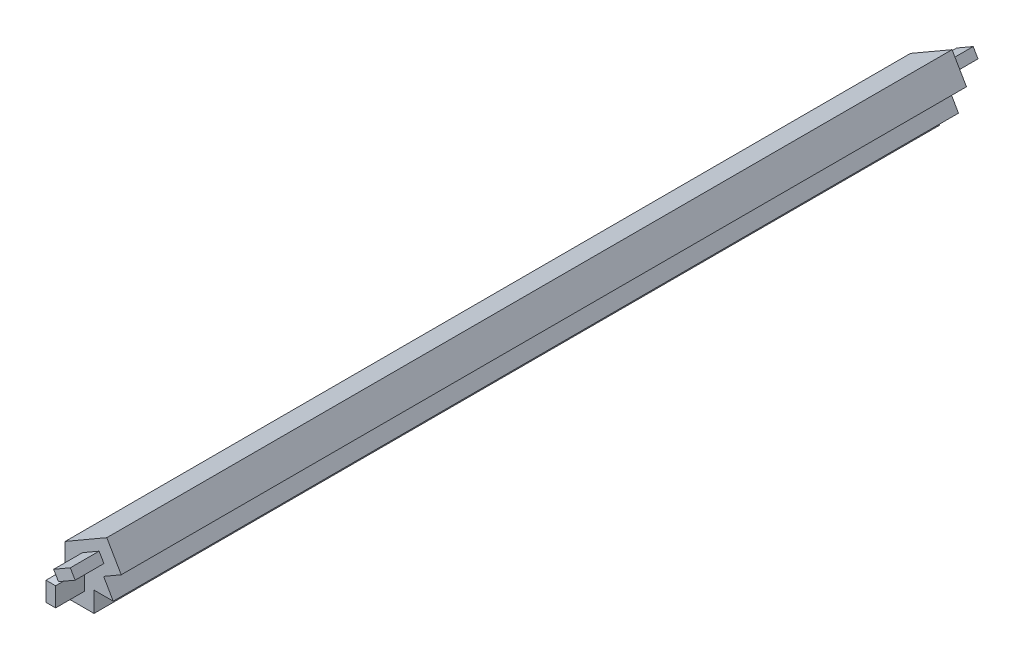
ISO-10303-21;
HEADER;
FILE_DESCRIPTION(('STEP AP214'),'2;1');
FILE_NAME('part.step','',(''),(''),'','','');
FILE_SCHEMA(('AUTOMOTIVE_DESIGN { 1 0 10303 214 1 1 1 1 }'));
ENDSEC;
DATA;
#1=APPLICATION_CONTEXT('core data for automotive mechanical design processes');
#2=APPLICATION_PROTOCOL_DEFINITION('international standard','automotive_design',2000,#1);
#3=PRODUCT_CONTEXT('',#1,'mechanical');
#4=PRODUCT('Part','Part','',(#3));
#5=PRODUCT_RELATED_PRODUCT_CATEGORY('part','',(#4));
#6=PRODUCT_DEFINITION_FORMATION('','',#4);
#7=PRODUCT_DEFINITION_CONTEXT('part definition',#1,'design');
#8=PRODUCT_DEFINITION('design','',#6,#7);
#9=PRODUCT_DEFINITION_SHAPE('','',#8);
#10=(LENGTH_UNIT() NAMED_UNIT(*) SI_UNIT(.MILLI.,.METRE.));
#11=(NAMED_UNIT(*) PLANE_ANGLE_UNIT() SI_UNIT($,.RADIAN.));
#12=(NAMED_UNIT(*) SI_UNIT($,.STERADIAN.) SOLID_ANGLE_UNIT());
#13=UNCERTAINTY_MEASURE_WITH_UNIT(LENGTH_MEASURE(1.E-05),#10,'distance_accuracy_value','');
#14=(GEOMETRIC_REPRESENTATION_CONTEXT(3) GLOBAL_UNCERTAINTY_ASSIGNED_CONTEXT((#13)) GLOBAL_UNIT_ASSIGNED_CONTEXT((#10,
#11,#12)) REPRESENTATION_CONTEXT('',''));
#15=CARTESIAN_POINT('',(0.,0.,0.));
#16=DIRECTION('',(0.,0.,1.));
#17=DIRECTION('',(1.,0.,0.));
#18=AXIS2_PLACEMENT_3D('',#15,#16,#17);
#19=CARTESIAN_POINT('',(0.,0.,0.));
#20=DIRECTION('',(0.,0.,1.));
#21=DIRECTION('',(1.,0.,0.));
#22=AXIS2_PLACEMENT_3D('',#19,#20,#21);
#23=PLANE('',#22);
#24=DIRECTION('',(0.865865076978215,0.500277591412518,0.));
#25=VECTOR('',#24,1.);
#26=CARTESIAN_POINT('',(-1.46919463916373,-10.0792061308996,0.));
#27=LINE('',#26,#25);
#28=CARTESIAN_POINT('',(-3.20239537188885,-11.080610981443,0.));
#29=VERTEX_POINT('',#28);
#30=CARTESIAN_POINT('',(-1.46919463916373,-10.0792061308996,0.));
#31=VERTEX_POINT('',#30);
#32=EDGE_CURVE('E217',#29,#31,#27,.T.);
#33=ORIENTED_EDGE('',*,*,#32,.F.);
#34=DIRECTION('',(-0.501747446527158,0.865014161677991,0.));
#35=VECTOR('',#34,1.);
#36=CARTESIAN_POINT('',(-2.70064720170764,-11.9456263907028,0.));
#37=LINE('',#36,#35);
#38=CARTESIAN_POINT('',(-2.70064720170764,-11.9456263907028,0.));
#39=VERTEX_POINT('',#38);
#40=EDGE_CURVE('E230',#39,#29,#37,.T.);
#41=ORIENTED_EDGE('',*,*,#40,.F.);
#42=DIRECTION('',(-0.865865076978215,-0.500277591412517,0.));
#43=VECTOR('',#42,1.);
#44=CARTESIAN_POINT('',(-0.968917047751212,-10.9450712078778,0.));
#45=LINE('',#44,#43);
#46=CARTESIAN_POINT('',(-0.968917047751212,-10.9450712078778,0.));
#47=VERTEX_POINT('',#46);
#48=EDGE_CURVE('E239',#47,#39,#45,.T.);
#49=ORIENTED_EDGE('',*,*,#48,.F.);
#50=DIRECTION('',(0.500277591412517,-0.865865076978215,0.));
#51=VECTOR('',#50,1.);
#52=CARTESIAN_POINT('',(-1.46919463916373,-10.0792061308996,0.));
#53=LINE('',#52,#51);
#54=EDGE_CURVE('E220',#31,#47,#53,.T.);
#55=ORIENTED_EDGE('',*,*,#54,.F.);
#56=EDGE_LOOP('',(#33,#41,#49,#55));
#57=FACE_BOUND('',#56,.T.);
#58=DIRECTION('',(-0.500277564516607,0.865865092518074,0.));
#59=VECTOR('',#58,1.);
#60=CARTESIAN_POINT('',(-0.670674615108924,-8.46292466680261,0.));
#61=LINE('',#60,#59);
#62=CARTESIAN_POINT('',(0.830158064033682,-11.0605199194213,0.));
#63=VERTEX_POINT('',#62);
#64=CARTESIAN_POINT('',(-0.670674615108924,-8.46292466680261,0.));
#65=VERTEX_POINT('',#64);
#66=EDGE_CURVE('E346',#63,#65,#61,.T.);
#67=ORIENTED_EDGE('',*,*,#66,.F.);
#68=DIRECTION('',(-0.865865092518073,-0.500277564516607,0.));
#69=VECTOR('',#68,1.);
#70=CARTESIAN_POINT('',(0.835633996138316,-11.05735604782,0.));
#71=LINE('',#70,#69);
#72=CARTESIAN_POINT('',(-1.,-12.1179444845952,0.));
#73=VERTEX_POINT('',#72);
#74=EDGE_CURVE('E36',#63,#73,#71,.T.);
#75=ORIENTED_EDGE('',*,*,#74,.T.);
#76=DIRECTION('',(0.499066724833894,-0.866563560371407,0.));
#77=VECTOR('',#76,1.);
#78=CARTESIAN_POINT('',(-1.,-12.1179444845952,0.));
#79=LINE('',#78,#77);
#80=CARTESIAN_POINT('',(0.,-13.8543126238652,0.));
#81=VERTEX_POINT('',#80);
#82=EDGE_CURVE('E323',#73,#81,#79,.T.);
#83=ORIENTED_EDGE('',*,*,#82,.T.);
#84=DIRECTION('',(-1.,0.,0.));
#85=VECTOR('',#84,1.);
#86=CARTESIAN_POINT('',(0.,-13.8543126238652,0.));
#87=LINE('',#86,#85);
#88=CARTESIAN_POINT('',(-2.,-13.8543126238652,0.));
#89=VERTEX_POINT('',#88);
#90=EDGE_CURVE('E331',#81,#89,#87,.T.);
#91=ORIENTED_EDGE('',*,*,#90,.T.);
#92=DIRECTION('',(0.,-1.,0.));
#93=VECTOR('',#92,1.);
#94=CARTESIAN_POINT('',(-2.,-15.9643126238652,0.));
#95=LINE('',#94,#93);
#96=CARTESIAN_POINT('',(-2.,-15.9643126238652,0.));
#97=VERTEX_POINT('',#96);
#98=EDGE_CURVE('E334',#89,#97,#95,.T.);
#99=ORIENTED_EDGE('',*,*,#98,.T.);
#100=DIRECTION('',(1.,0.,0.));
#101=VECTOR('',#100,1.);
#102=CARTESIAN_POINT('',(0.,-15.9643126238652,0.));
#103=LINE('',#102,#101);
#104=CARTESIAN_POINT('',(-5.,-15.9643126238652,0.));
#105=VERTEX_POINT('',#104);
#106=EDGE_CURVE('E351',#105,#97,#103,.T.);
#107=ORIENTED_EDGE('',*,*,#106,.F.);
#108=DIRECTION('',(0.,-1.,0.));
#109=VECTOR('',#108,1.);
#110=CARTESIAN_POINT('',(-5.,-15.9643126238652,0.));
#111=LINE('',#110,#109);
#112=CARTESIAN_POINT('',(-5.,-10.9643126238652,0.));
#113=VERTEX_POINT('',#112);
#114=EDGE_CURVE('E382',#113,#105,#111,.T.);
#115=ORIENTED_EDGE('',*,*,#114,.F.);
#116=DIRECTION('',(-0.865865076978215,-0.500277591412517,0.));
#117=VECTOR('',#116,1.);
#118=CARTESIAN_POINT('',(-5.,-10.9643126238652,0.));
#119=LINE('',#118,#117);
#120=EDGE_CURVE('E361',#65,#113,#119,.T.);
#121=ORIENTED_EDGE('',*,*,#120,.F.);
#122=EDGE_LOOP('',(#67,#75,#83,#91,#99,#107,#115,#121));
#123=FACE_BOUND('',#122,.T.);
#124=DIRECTION('',(1.,0.,0.));
#125=VECTOR('',#124,1.);
#126=CARTESIAN_POINT('',(-4.00195146559209,-12.4659946892871,0.));
#127=LINE('',#126,#125);
#128=CARTESIAN_POINT('',(-4.00195146559209,-12.4659946892871,0.));
#129=VERTEX_POINT('',#128);
#130=CARTESIAN_POINT('',(-3.00195146559209,-12.4659946892871,0.));
#131=VERTEX_POINT('',#130);
#132=EDGE_CURVE('E216',#129,#131,#127,.T.);
#133=ORIENTED_EDGE('',*,*,#132,.F.);
#134=DIRECTION('',(0.,1.,0.));
#135=VECTOR('',#134,1.);
#136=CARTESIAN_POINT('',(-4.00195146559209,-12.4659946892871,0.));
#137=LINE('',#136,#135);
#138=CARTESIAN_POINT('',(-4.00195146559209,-14.4659946892871,0.));
#139=VERTEX_POINT('',#138);
#140=EDGE_CURVE('E213',#139,#129,#137,.T.);
#141=ORIENTED_EDGE('',*,*,#140,.F.);
#142=DIRECTION('',(-1.,0.,0.));
#143=VECTOR('',#142,1.);
#144=CARTESIAN_POINT('',(-3.00195146559209,-14.4659946892871,0.));
#145=LINE('',#144,#143);
#146=CARTESIAN_POINT('',(-3.00195146559209,-14.4659946892871,0.));
#147=VERTEX_POINT('',#146);
#148=EDGE_CURVE('E55',#147,#139,#145,.T.);
#149=ORIENTED_EDGE('',*,*,#148,.F.);
#150=DIRECTION('',(0.,-1.,0.));
#151=VECTOR('',#150,1.);
#152=CARTESIAN_POINT('',(-3.00195146559209,-12.4659946892871,0.));
#153=LINE('',#152,#151);
#154=EDGE_CURVE('E50',#131,#147,#153,.T.);
#155=ORIENTED_EDGE('',*,*,#154,.F.);
#156=EDGE_LOOP('',(#133,#141,#149,#155));
#157=FACE_BOUND('',#156,.T.);
#158=ADVANCED_FACE('F32',(#57,#123,#157),#23,.F.);
#159=CARTESIAN_POINT('',(0.,0.,88.));
#160=DIRECTION('',(0.,0.,1.));
#161=DIRECTION('',(1.,0.,0.));
#162=AXIS2_PLACEMENT_3D('',#159,#160,#161);
#163=PLANE('',#162);
#164=DIRECTION('',(0.500277591412517,-0.865865076978215,0.));
#165=VECTOR('',#164,1.);
#166=CARTESIAN_POINT('',(-3.20092479312016,-11.0797613137246,88.));
#167=LINE('',#166,#165);
#168=CARTESIAN_POINT('',(-3.20092479312016,-11.0797613137246,88.));
#169=VERTEX_POINT('',#168);
#170=CARTESIAN_POINT('',(-2.70064720170764,-11.9456263907028,88.));
#171=VERTEX_POINT('',#170);
#172=EDGE_CURVE('E284',#169,#171,#167,.T.);
#173=ORIENTED_EDGE('',*,*,#172,.F.);
#174=DIRECTION('',(-0.865865076978215,-0.500277591412517,0.));
#175=VECTOR('',#174,1.);
#176=CARTESIAN_POINT('',(-3.20092479312016,-11.0797613137246,88.));
#177=LINE('',#176,#175);
#178=CARTESIAN_POINT('',(-1.46919463916373,-10.0792061308996,88.));
#179=VERTEX_POINT('',#178);
#180=EDGE_CURVE('E289',#179,#169,#177,.T.);
#181=ORIENTED_EDGE('',*,*,#180,.F.);
#182=DIRECTION('',(-0.500277591412517,0.865865076978215,0.));
#183=VECTOR('',#182,1.);
#184=CARTESIAN_POINT('',(-0.968917047751211,-10.9450712078778,88.));
#185=LINE('',#184,#183);
#186=CARTESIAN_POINT('',(-0.968917047751211,-10.9450712078778,88.));
#187=VERTEX_POINT('',#186);
#188=EDGE_CURVE('E301',#187,#179,#185,.T.);
#189=ORIENTED_EDGE('',*,*,#188,.F.);
#190=DIRECTION('',(0.865865076978215,0.500277591412517,0.));
#191=VECTOR('',#190,1.);
#192=CARTESIAN_POINT('',(-2.70064720170764,-11.9456263907028,88.));
#193=LINE('',#192,#191);
#194=EDGE_CURVE('E298',#171,#187,#193,.T.);
#195=ORIENTED_EDGE('',*,*,#194,.F.);
#196=EDGE_LOOP('',(#173,#181,#189,#195));
#197=FACE_BOUND('',#196,.T.);
#198=DIRECTION('',(-1.,0.,0.));
#199=VECTOR('',#198,1.);
#200=CARTESIAN_POINT('',(0.,-13.8543126238652,88.));
#201=LINE('',#200,#199);
#202=CARTESIAN_POINT('',(0.,-13.8543126238652,88.));
#203=VERTEX_POINT('',#202);
#204=CARTESIAN_POINT('',(-2.,-13.8543126238652,88.));
#205=VERTEX_POINT('',#204);
#206=EDGE_CURVE('E339',#203,#205,#201,.T.);
#207=ORIENTED_EDGE('',*,*,#206,.F.);
#208=DIRECTION('',(0.499066724833894,-0.866563560371407,0.));
#209=VECTOR('',#208,1.);
#210=CARTESIAN_POINT('',(-1.,-12.1179444845952,88.));
#211=LINE('',#210,#209);
#212=CARTESIAN_POINT('',(-0.999999999999999,-12.1179444845952,88.));
#213=VERTEX_POINT('',#212);
#214=EDGE_CURVE('E320',#213,#203,#211,.T.);
#215=ORIENTED_EDGE('',*,*,#214,.F.);
#216=DIRECTION('',(-0.865865092518073,-0.500277564516607,0.));
#217=VECTOR('',#216,1.);
#218=CARTESIAN_POINT('',(0.835633996138316,-11.05735604782,88.));
#219=LINE('',#218,#217);
#220=CARTESIAN_POINT('',(0.830158064033682,-11.0605199194213,88.));
#221=VERTEX_POINT('',#220);
#222=EDGE_CURVE('E317',#221,#213,#219,.T.);
#223=ORIENTED_EDGE('',*,*,#222,.F.);
#224=DIRECTION('',(-0.500277564516607,0.865865092518074,0.));
#225=VECTOR('',#224,1.);
#226=CARTESIAN_POINT('',(-0.670674615108924,-8.46292466680261,88.));
#227=LINE('',#226,#225);
#228=CARTESIAN_POINT('',(-0.670674615108924,-8.46292466680261,88.));
#229=VERTEX_POINT('',#228);
#230=EDGE_CURVE('E348',#221,#229,#227,.T.);
#231=ORIENTED_EDGE('',*,*,#230,.T.);
#232=DIRECTION('',(-0.865865076978215,-0.500277591412517,0.));
#233=VECTOR('',#232,1.);
#234=CARTESIAN_POINT('',(-5.,-10.9643126238652,88.));
#235=LINE('',#234,#233);
#236=CARTESIAN_POINT('',(-5.,-10.9643126238652,88.));
#237=VERTEX_POINT('',#236);
#238=EDGE_CURVE('E350',#229,#237,#235,.T.);
#239=ORIENTED_EDGE('',*,*,#238,.T.);
#240=DIRECTION('',(0.,-1.,0.));
#241=VECTOR('',#240,1.);
#242=CARTESIAN_POINT('',(-5.,-15.9643126238652,88.));
#243=LINE('',#242,#241);
#244=CARTESIAN_POINT('',(-5.,-15.9643126238652,88.));
#245=VERTEX_POINT('',#244);
#246=EDGE_CURVE('E353',#237,#245,#243,.T.);
#247=ORIENTED_EDGE('',*,*,#246,.T.);
#248=DIRECTION('',(1.,0.,0.));
#249=VECTOR('',#248,1.);
#250=CARTESIAN_POINT('',(0.,-15.9643126238652,88.));
#251=LINE('',#250,#249);
#252=CARTESIAN_POINT('',(-2.,-15.9643126238652,88.));
#253=VERTEX_POINT('',#252);
#254=EDGE_CURVE('E355',#245,#253,#251,.T.);
#255=ORIENTED_EDGE('',*,*,#254,.T.);
#256=DIRECTION('',(0.,-1.,0.));
#257=VECTOR('',#256,1.);
#258=CARTESIAN_POINT('',(-2.,-15.9643126238652,88.));
#259=LINE('',#258,#257);
#260=EDGE_CURVE('E335',#205,#253,#259,.T.);
#261=ORIENTED_EDGE('',*,*,#260,.F.);
#262=EDGE_LOOP('',(#207,#215,#223,#231,#239,#247,#255,#261));
#263=FACE_BOUND('',#262,.T.);
#264=DIRECTION('',(0.,-1.,0.));
#265=VECTOR('',#264,1.);
#266=CARTESIAN_POINT('',(-4.,-12.4643126238652,88.));
#267=LINE('',#266,#265);
#268=CARTESIAN_POINT('',(-4.,-12.4643126238652,88.));
#269=VERTEX_POINT('',#268);
#270=CARTESIAN_POINT('',(-4.,-14.4643126238652,88.));
#271=VERTEX_POINT('',#270);
#272=EDGE_CURVE('E269',#269,#271,#267,.T.);
#273=ORIENTED_EDGE('',*,*,#272,.F.);
#274=DIRECTION('',(-1.,0.,0.));
#275=VECTOR('',#274,1.);
#276=CARTESIAN_POINT('',(-3.,-12.4643126238652,88.));
#277=LINE('',#276,#275);
#278=CARTESIAN_POINT('',(-3.,-12.4643126238652,88.));
#279=VERTEX_POINT('',#278);
#280=EDGE_CURVE('E255',#279,#269,#277,.T.);
#281=ORIENTED_EDGE('',*,*,#280,.F.);
#282=DIRECTION('',(0.,1.,0.));
#283=VECTOR('',#282,1.);
#284=CARTESIAN_POINT('',(-3.,-14.4643126238652,88.));
#285=LINE('',#284,#283);
#286=CARTESIAN_POINT('',(-3.,-14.4643126238652,88.));
#287=VERTEX_POINT('',#286);
#288=EDGE_CURVE('E260',#287,#279,#285,.T.);
#289=ORIENTED_EDGE('',*,*,#288,.F.);
#290=DIRECTION('',(1.,0.,0.));
#291=VECTOR('',#290,1.);
#292=CARTESIAN_POINT('',(-4.,-14.4643126238652,88.));
#293=LINE('',#292,#291);
#294=EDGE_CURVE('E271',#271,#287,#293,.T.);
#295=ORIENTED_EDGE('',*,*,#294,.F.);
#296=EDGE_LOOP('',(#273,#281,#289,#295));
#297=FACE_BOUND('',#296,.T.);
#298=ADVANCED_FACE('F399',(#197,#263,#297),#163,.T.);
#299=CARTESIAN_POINT('',(-0.670674615108924,-8.46292466680261,88.));
#300=DIRECTION('',(-0.865865092518074,-0.500277564516607,0.));
#301=DIRECTION('',(0.500277564516607,-0.865865092518074,0.));
#302=AXIS2_PLACEMENT_3D('',#299,#300,#301);
#303=PLANE('',#302);
#304=DIRECTION('',(0.,0.,1.));
#305=VECTOR('',#304,1.);
#306=CARTESIAN_POINT('',(0.830158064033682,-11.0605199194213,88.));
#307=LINE('',#306,#305);
#308=EDGE_CURVE('E319',#63,#221,#307,.T.);
#309=ORIENTED_EDGE('',*,*,#308,.F.);
#310=ORIENTED_EDGE('',*,*,#66,.T.);
#311=DIRECTION('',(0.,0.,-1.));
#312=VECTOR('',#311,1.);
#313=CARTESIAN_POINT('',(-0.670674615108924,-8.46292466680261,88.));
#314=LINE('',#313,#312);
#315=EDGE_CURVE('E42',#229,#65,#314,.T.);
#316=ORIENTED_EDGE('',*,*,#315,.F.);
#317=ORIENTED_EDGE('',*,*,#230,.F.);
#318=EDGE_LOOP('',(#309,#310,#316,#317));
#319=FACE_BOUND('',#318,.T.);
#320=ADVANCED_FACE('F34',(#319),#303,.F.);
#321=CARTESIAN_POINT('',(-5.,-10.9643126238652,88.));
#322=DIRECTION('',(0.500277591412517,-0.865865076978215,0.));
#323=DIRECTION('',(0.865865076978215,0.500277591412517,0.));
#324=AXIS2_PLACEMENT_3D('',#321,#322,#323);
#325=PLANE('',#324);
#326=ORIENTED_EDGE('',*,*,#120,.T.);
#327=DIRECTION('',(0.,0.,-1.));
#328=VECTOR('',#327,1.);
#329=CARTESIAN_POINT('',(-5.,-10.9643126238652,88.));
#330=LINE('',#329,#328);
#331=EDGE_CURVE('E393',#237,#113,#330,.T.);
#332=ORIENTED_EDGE('',*,*,#331,.F.);
#333=ORIENTED_EDGE('',*,*,#238,.F.);
#334=ORIENTED_EDGE('',*,*,#315,.T.);
#335=EDGE_LOOP('',(#326,#332,#333,#334));
#336=FACE_BOUND('',#335,.T.);
#337=ADVANCED_FACE('F395',(#336),#325,.F.);
#338=CARTESIAN_POINT('',(-5.,-15.9643126238652,88.));
#339=DIRECTION('',(1.,0.,0.));
#340=DIRECTION('',(0.,0.,-1.));
#341=AXIS2_PLACEMENT_3D('',#338,#339,#340);
#342=PLANE('',#341);
#343=ORIENTED_EDGE('',*,*,#114,.T.);
#344=DIRECTION('',(0.,0.,-1.));
#345=VECTOR('',#344,1.);
#346=CARTESIAN_POINT('',(-5.,-15.9643126238652,88.));
#347=LINE('',#346,#345);
#348=EDGE_CURVE('E358',#245,#105,#347,.T.);
#349=ORIENTED_EDGE('',*,*,#348,.F.);
#350=ORIENTED_EDGE('',*,*,#246,.F.);
#351=ORIENTED_EDGE('',*,*,#331,.T.);
#352=EDGE_LOOP('',(#343,#349,#350,#351));
#353=FACE_BOUND('',#352,.T.);
#354=ADVANCED_FACE('F412',(#353),#342,.F.);
#355=CARTESIAN_POINT('',(0.,-15.9643126238652,88.));
#356=DIRECTION('',(0.,1.,0.));
#357=DIRECTION('',(0.,0.,1.));
#358=AXIS2_PLACEMENT_3D('',#355,#356,#357);
#359=PLANE('',#358);
#360=ORIENTED_EDGE('',*,*,#106,.T.);
#361=DIRECTION('',(0.,0.,1.));
#362=VECTOR('',#361,1.);
#363=CARTESIAN_POINT('',(-2.,-15.9643126238652,0.));
#364=LINE('',#363,#362);
#365=EDGE_CURVE('E343',#97,#253,#364,.T.);
#366=ORIENTED_EDGE('',*,*,#365,.T.);
#367=ORIENTED_EDGE('',*,*,#254,.F.);
#368=ORIENTED_EDGE('',*,*,#348,.T.);
#369=EDGE_LOOP('',(#360,#366,#367,#368));
#370=FACE_BOUND('',#369,.T.);
#371=ADVANCED_FACE('F411',(#370),#359,.F.);
#372=CARTESIAN_POINT('',(-2.,-15.9643126238652,0.));
#373=DIRECTION('',(-1.,0.,0.));
#374=DIRECTION('',(0.,0.,1.));
#375=AXIS2_PLACEMENT_3D('',#372,#373,#374);
#376=PLANE('',#375);
#377=ORIENTED_EDGE('',*,*,#260,.T.);
#378=ORIENTED_EDGE('',*,*,#365,.F.);
#379=ORIENTED_EDGE('',*,*,#98,.F.);
#380=DIRECTION('',(0.,0.,1.));
#381=VECTOR('',#380,1.);
#382=CARTESIAN_POINT('',(-2.,-13.8543126238652,0.));
#383=LINE('',#382,#381);
#384=EDGE_CURVE('E338',#89,#205,#383,.T.);
#385=ORIENTED_EDGE('',*,*,#384,.T.);
#386=EDGE_LOOP('',(#377,#378,#379,#385));
#387=FACE_BOUND('',#386,.T.);
#388=ADVANCED_FACE('F408',(#387),#376,.F.);
#389=CARTESIAN_POINT('',(0.,-13.8543126238652,0.));
#390=DIRECTION('',(0.,1.,0.));
#391=DIRECTION('',(0.,0.,1.));
#392=AXIS2_PLACEMENT_3D('',#389,#390,#391);
#393=PLANE('',#392);
#394=ORIENTED_EDGE('',*,*,#206,.T.);
#395=ORIENTED_EDGE('',*,*,#384,.F.);
#396=ORIENTED_EDGE('',*,*,#90,.F.);
#397=DIRECTION('',(0.,0.,-1.));
#398=VECTOR('',#397,1.);
#399=CARTESIAN_POINT('',(0.,-13.8543126238652,88.));
#400=LINE('',#399,#398);
#401=EDGE_CURVE('E11',#203,#81,#400,.T.);
#402=ORIENTED_EDGE('',*,*,#401,.F.);
#403=EDGE_LOOP('',(#394,#395,#396,#402));
#404=FACE_BOUND('',#403,.T.);
#405=ADVANCED_FACE('F406',(#404),#393,.F.);
#406=CARTESIAN_POINT('',(0.835633996138316,-11.05735604782,308.728620001845));
#407=DIRECTION('',(0.500277564516607,-0.865865092518073,0.));
#408=DIRECTION('',(0.865865092518073,0.500277564516607,0.));
#409=AXIS2_PLACEMENT_3D('',#406,#407,#408);
#410=PLANE('',#409);
#411=ORIENTED_EDGE('',*,*,#74,.F.);
#412=ORIENTED_EDGE('',*,*,#308,.T.);
#413=ORIENTED_EDGE('',*,*,#222,.T.);
#414=DIRECTION('',(0.,0.,-1.));
#415=VECTOR('',#414,1.);
#416=CARTESIAN_POINT('',(-1.,-12.1179444845952,308.728620001845));
#417=LINE('',#416,#415);
#418=EDGE_CURVE('E326',#213,#73,#417,.T.);
#419=ORIENTED_EDGE('',*,*,#418,.T.);
#420=EDGE_LOOP('',(#411,#412,#413,#419));
#421=FACE_BOUND('',#420,.T.);
#422=ADVANCED_FACE('F370',(#421),#410,.T.);
#423=CARTESIAN_POINT('',(-1.,-12.1179444845952,308.728620001845));
#424=DIRECTION('',(0.866563560371407,0.499066724833894,0.));
#425=DIRECTION('',(-0.499066724833894,0.866563560371407,0.));
#426=AXIS2_PLACEMENT_3D('',#423,#424,#425);
#427=PLANE('',#426);
#428=ORIENTED_EDGE('',*,*,#418,.F.);
#429=ORIENTED_EDGE('',*,*,#214,.T.);
#430=ORIENTED_EDGE('',*,*,#401,.T.);
#431=ORIENTED_EDGE('',*,*,#82,.F.);
#432=EDGE_LOOP('',(#428,#429,#430,#431));
#433=FACE_BOUND('',#432,.T.);
#434=ADVANCED_FACE('F403',(#433),#427,.T.);
#435=CARTESIAN_POINT('',(-3.20092479312016,-11.0797613137246,91.));
#436=DIRECTION('',(0.865865076978215,0.500277591412517,0.));
#437=DIRECTION('',(-0.500277591412517,0.865865076978215,0.));
#438=AXIS2_PLACEMENT_3D('',#435,#436,#437);
#439=PLANE('',#438);
#440=ORIENTED_EDGE('',*,*,#172,.T.);
#441=DIRECTION('',(0.,0.,-1.));
#442=VECTOR('',#441,1.);
#443=CARTESIAN_POINT('',(-2.70064720170764,-11.9456263907028,91.));
#444=LINE('',#443,#442);
#445=CARTESIAN_POINT('',(-2.70064720170764,-11.9456263907028,91.));
#446=VERTEX_POINT('',#445);
#447=EDGE_CURVE('E314',#446,#171,#444,.T.);
#448=ORIENTED_EDGE('',*,*,#447,.F.);
#449=DIRECTION('',(0.500277591412517,-0.865865076978215,0.));
#450=VECTOR('',#449,1.);
#451=CARTESIAN_POINT('',(-3.20092479312016,-11.0797613137246,91.));
#452=LINE('',#451,#450);
#453=CARTESIAN_POINT('',(-3.20092479312016,-11.0797613137246,91.));
#454=VERTEX_POINT('',#453);
#455=EDGE_CURVE('E285',#454,#446,#452,.T.);
#456=ORIENTED_EDGE('',*,*,#455,.F.);
#457=DIRECTION('',(0.,0.,-1.));
#458=VECTOR('',#457,1.);
#459=CARTESIAN_POINT('',(-3.20092479312016,-11.0797613137246,91.));
#460=LINE('',#459,#458);
#461=EDGE_CURVE('E295',#454,#169,#460,.T.);
#462=ORIENTED_EDGE('',*,*,#461,.T.);
#463=EDGE_LOOP('',(#440,#448,#456,#462));
#464=FACE_BOUND('',#463,.T.);
#465=ADVANCED_FACE('F437',(#464),#439,.F.);
#466=CARTESIAN_POINT('',(-2.70064720170764,-11.9456263907028,91.));
#467=DIRECTION('',(-0.500277591412517,0.865865076978215,0.));
#468=DIRECTION('',(-0.865865076978215,-0.500277591412517,0.));
#469=AXIS2_PLACEMENT_3D('',#466,#467,#468);
#470=PLANE('',#469);
#471=ORIENTED_EDGE('',*,*,#194,.T.);
#472=DIRECTION('',(0.,0.,-1.));
#473=VECTOR('',#472,1.);
#474=CARTESIAN_POINT('',(-0.968917047751211,-10.9450712078778,91.));
#475=LINE('',#474,#473);
#476=CARTESIAN_POINT('',(-0.968917047751211,-10.9450712078778,91.));
#477=VERTEX_POINT('',#476);
#478=EDGE_CURVE('E311',#477,#187,#475,.T.);
#479=ORIENTED_EDGE('',*,*,#478,.F.);
#480=DIRECTION('',(0.865865076978215,0.500277591412517,0.));
#481=VECTOR('',#480,1.);
#482=CARTESIAN_POINT('',(-2.70064720170764,-11.9456263907028,91.));
#483=LINE('',#482,#481);
#484=EDGE_CURVE('E288',#446,#477,#483,.T.);
#485=ORIENTED_EDGE('',*,*,#484,.F.);
#486=ORIENTED_EDGE('',*,*,#447,.T.);
#487=EDGE_LOOP('',(#471,#479,#485,#486));
#488=FACE_BOUND('',#487,.T.);
#489=ADVANCED_FACE('F440',(#488),#470,.F.);
#490=CARTESIAN_POINT('',(-0.968917047751211,-10.9450712078778,91.));
#491=DIRECTION('',(-0.865865076978215,-0.500277591412517,0.));
#492=DIRECTION('',(0.500277591412518,-0.865865076978215,0.));
#493=AXIS2_PLACEMENT_3D('',#490,#491,#492);
#494=PLANE('',#493);
#495=ORIENTED_EDGE('',*,*,#188,.T.);
#496=DIRECTION('',(0.,0.,-1.));
#497=VECTOR('',#496,1.);
#498=CARTESIAN_POINT('',(-1.46919463916373,-10.0792061308996,91.));
#499=LINE('',#498,#497);
#500=CARTESIAN_POINT('',(-1.46919463916373,-10.0792061308996,91.));
#501=VERTEX_POINT('',#500);
#502=EDGE_CURVE('E308',#501,#179,#499,.T.);
#503=ORIENTED_EDGE('',*,*,#502,.F.);
#504=DIRECTION('',(-0.500277591412517,0.865865076978215,0.));
#505=VECTOR('',#504,1.);
#506=CARTESIAN_POINT('',(-0.968917047751211,-10.9450712078778,91.));
#507=LINE('',#506,#505);
#508=EDGE_CURVE('E291',#477,#501,#507,.T.);
#509=ORIENTED_EDGE('',*,*,#508,.F.);
#510=ORIENTED_EDGE('',*,*,#478,.T.);
#511=EDGE_LOOP('',(#495,#503,#509,#510));
#512=FACE_BOUND('',#511,.T.);
#513=ADVANCED_FACE('F444',(#512),#494,.F.);
#514=CARTESIAN_POINT('',(-3.20092479312016,-11.0797613137246,91.));
#515=DIRECTION('',(0.500277591412517,-0.865865076978215,0.));
#516=DIRECTION('',(0.865865076978215,0.500277591412517,0.));
#517=AXIS2_PLACEMENT_3D('',#514,#515,#516);
#518=PLANE('',#517);
#519=ORIENTED_EDGE('',*,*,#180,.T.);
#520=ORIENTED_EDGE('',*,*,#461,.F.);
#521=DIRECTION('',(-0.865865076978215,-0.500277591412517,0.));
#522=VECTOR('',#521,1.);
#523=CARTESIAN_POINT('',(-3.20092479312016,-11.0797613137246,91.));
#524=LINE('',#523,#522);
#525=EDGE_CURVE('E293',#501,#454,#524,.T.);
#526=ORIENTED_EDGE('',*,*,#525,.F.);
#527=ORIENTED_EDGE('',*,*,#502,.T.);
#528=EDGE_LOOP('',(#519,#520,#526,#527));
#529=FACE_BOUND('',#528,.T.);
#530=ADVANCED_FACE('F448',(#529),#518,.F.);
#531=CARTESIAN_POINT('',(0.,0.,91.));
#532=DIRECTION('',(0.,0.,1.));
#533=DIRECTION('',(1.,0.,0.));
#534=AXIS2_PLACEMENT_3D('',#531,#532,#533);
#535=PLANE('',#534);
#536=ORIENTED_EDGE('',*,*,#455,.T.);
#537=ORIENTED_EDGE('',*,*,#484,.T.);
#538=ORIENTED_EDGE('',*,*,#508,.T.);
#539=ORIENTED_EDGE('',*,*,#525,.T.);
#540=EDGE_LOOP('',(#536,#537,#538,#539));
#541=FACE_BOUND('',#540,.T.);
#542=ADVANCED_FACE('F452',(#541),#535,.T.);
#543=CARTESIAN_POINT('',(-3.,-12.4643126238652,91.));
#544=DIRECTION('',(0.,-1.,0.));
#545=DIRECTION('',(0.,0.,-1.));
#546=AXIS2_PLACEMENT_3D('',#543,#544,#545);
#547=PLANE('',#546);
#548=ORIENTED_EDGE('',*,*,#280,.T.);
#549=DIRECTION('',(0.,0.,-1.));
#550=VECTOR('',#549,1.);
#551=CARTESIAN_POINT('',(-4.,-12.4643126238652,91.));
#552=LINE('',#551,#550);
#553=CARTESIAN_POINT('',(-4.,-12.4643126238652,91.));
#554=VERTEX_POINT('',#553);
#555=EDGE_CURVE('E282',#554,#269,#552,.T.);
#556=ORIENTED_EDGE('',*,*,#555,.F.);
#557=DIRECTION('',(-1.,0.,0.));
#558=VECTOR('',#557,1.);
#559=CARTESIAN_POINT('',(-3.,-12.4643126238652,91.));
#560=LINE('',#559,#558);
#561=CARTESIAN_POINT('',(-3.,-12.4643126238652,91.));
#562=VERTEX_POINT('',#561);
#563=EDGE_CURVE('E256',#562,#554,#560,.T.);
#564=ORIENTED_EDGE('',*,*,#563,.F.);
#565=DIRECTION('',(0.,0.,-1.));
#566=VECTOR('',#565,1.);
#567=CARTESIAN_POINT('',(-3.,-12.4643126238652,91.));
#568=LINE('',#567,#566);
#569=EDGE_CURVE('E266',#562,#279,#568,.T.);
#570=ORIENTED_EDGE('',*,*,#569,.T.);
#571=EDGE_LOOP('',(#548,#556,#564,#570));
#572=FACE_BOUND('',#571,.T.);
#573=ADVANCED_FACE('F456',(#572),#547,.F.);
#574=CARTESIAN_POINT('',(-4.,-12.4643126238652,91.));
#575=DIRECTION('',(1.,0.,0.));
#576=DIRECTION('',(0.,0.,-1.));
#577=AXIS2_PLACEMENT_3D('',#574,#575,#576);
#578=PLANE('',#577);
#579=ORIENTED_EDGE('',*,*,#272,.T.);
#580=DIRECTION('',(0.,0.,-1.));
#581=VECTOR('',#580,1.);
#582=CARTESIAN_POINT('',(-4.,-14.4643126238652,91.));
#583=LINE('',#582,#581);
#584=CARTESIAN_POINT('',(-4.,-14.4643126238652,91.));
#585=VERTEX_POINT('',#584);
#586=EDGE_CURVE('E279',#585,#271,#583,.T.);
#587=ORIENTED_EDGE('',*,*,#586,.F.);
#588=DIRECTION('',(0.,-1.,0.));
#589=VECTOR('',#588,1.);
#590=CARTESIAN_POINT('',(-4.,-12.4643126238652,91.));
#591=LINE('',#590,#589);
#592=EDGE_CURVE('E259',#554,#585,#591,.T.);
#593=ORIENTED_EDGE('',*,*,#592,.F.);
#594=ORIENTED_EDGE('',*,*,#555,.T.);
#595=EDGE_LOOP('',(#579,#587,#593,#594));
#596=FACE_BOUND('',#595,.T.);
#597=ADVANCED_FACE('F460',(#596),#578,.F.);
#598=CARTESIAN_POINT('',(-4.,-14.4643126238652,91.));
#599=DIRECTION('',(0.,1.,0.));
#600=DIRECTION('',(0.,0.,1.));
#601=AXIS2_PLACEMENT_3D('',#598,#599,#600);
#602=PLANE('',#601);
#603=ORIENTED_EDGE('',*,*,#294,.T.);
#604=DIRECTION('',(0.,0.,-1.));
#605=VECTOR('',#604,1.);
#606=CARTESIAN_POINT('',(-3.,-14.4643126238652,91.));
#607=LINE('',#606,#605);
#608=CARTESIAN_POINT('',(-3.,-14.4643126238652,91.));
#609=VERTEX_POINT('',#608);
#610=EDGE_CURVE('E277',#609,#287,#607,.T.);
#611=ORIENTED_EDGE('',*,*,#610,.F.);
#612=DIRECTION('',(1.,0.,0.));
#613=VECTOR('',#612,1.);
#614=CARTESIAN_POINT('',(-4.,-14.4643126238652,91.));
#615=LINE('',#614,#613);
#616=EDGE_CURVE('E262',#585,#609,#615,.T.);
#617=ORIENTED_EDGE('',*,*,#616,.F.);
#618=ORIENTED_EDGE('',*,*,#586,.T.);
#619=EDGE_LOOP('',(#603,#611,#617,#618));
#620=FACE_BOUND('',#619,.T.);
#621=ADVANCED_FACE('F464',(#620),#602,.F.);
#622=CARTESIAN_POINT('',(-3.,-14.4643126238652,91.));
#623=DIRECTION('',(-1.,0.,0.));
#624=DIRECTION('',(0.,0.,1.));
#625=AXIS2_PLACEMENT_3D('',#622,#623,#624);
#626=PLANE('',#625);
#627=ORIENTED_EDGE('',*,*,#288,.T.);
#628=ORIENTED_EDGE('',*,*,#569,.F.);
#629=DIRECTION('',(0.,1.,0.));
#630=VECTOR('',#629,1.);
#631=CARTESIAN_POINT('',(-3.,-14.4643126238652,91.));
#632=LINE('',#631,#630);
#633=EDGE_CURVE('E264',#609,#562,#632,.T.);
#634=ORIENTED_EDGE('',*,*,#633,.F.);
#635=ORIENTED_EDGE('',*,*,#610,.T.);
#636=EDGE_LOOP('',(#627,#628,#634,#635));
#637=FACE_BOUND('',#636,.T.);
#638=ADVANCED_FACE('F468',(#637),#626,.F.);
#639=CARTESIAN_POINT('',(0.,0.,91.));
#640=DIRECTION('',(0.,0.,1.));
#641=DIRECTION('',(1.,0.,0.));
#642=AXIS2_PLACEMENT_3D('',#639,#640,#641);
#643=PLANE('',#642);
#644=ORIENTED_EDGE('',*,*,#563,.T.);
#645=ORIENTED_EDGE('',*,*,#592,.T.);
#646=ORIENTED_EDGE('',*,*,#616,.T.);
#647=ORIENTED_EDGE('',*,*,#633,.T.);
#648=EDGE_LOOP('',(#644,#645,#646,#647));
#649=FACE_BOUND('',#648,.T.);
#650=ADVANCED_FACE('F472',(#649),#643,.T.);
#651=CARTESIAN_POINT('',(-1.46919463916373,-10.0792061308996,-3.));
#652=DIRECTION('',(0.500277591412518,-0.865865076978215,0.));
#653=DIRECTION('',(0.865865076978215,0.500277591412518,0.));
#654=AXIS2_PLACEMENT_3D('',#651,#652,#653);
#655=PLANE('',#654);
#656=ORIENTED_EDGE('',*,*,#32,.T.);
#657=DIRECTION('',(0.,0.,1.));
#658=VECTOR('',#657,1.);
#659=CARTESIAN_POINT('',(-1.46919463916373,-10.0792061308996,-3.));
#660=LINE('',#659,#658);
#661=CARTESIAN_POINT('',(-1.46919463916373,-10.0792061308996,-3.));
#662=VERTEX_POINT('',#661);
#663=EDGE_CURVE('E252',#662,#31,#660,.T.);
#664=ORIENTED_EDGE('',*,*,#663,.F.);
#665=DIRECTION('',(0.865865076978215,0.500277591412518,0.));
#666=VECTOR('',#665,1.);
#667=CARTESIAN_POINT('',(-1.46919463916373,-10.0792061308996,-3.));
#668=LINE('',#667,#666);
#669=CARTESIAN_POINT('',(-3.20239537188885,-11.080610981443,-3.));
#670=VERTEX_POINT('',#669);
#671=EDGE_CURVE('E226',#670,#662,#668,.T.);
#672=ORIENTED_EDGE('',*,*,#671,.F.);
#673=DIRECTION('',(0.,0.,1.));
#674=VECTOR('',#673,1.);
#675=CARTESIAN_POINT('',(-3.20239537188885,-11.080610981443,-3.));
#676=LINE('',#675,#674);
#677=EDGE_CURVE('E235',#670,#29,#676,.T.);
#678=ORIENTED_EDGE('',*,*,#677,.T.);
#679=EDGE_LOOP('',(#656,#664,#672,#678));
#680=FACE_BOUND('',#679,.T.);
#681=ADVANCED_FACE('F476',(#680),#655,.F.);
#682=CARTESIAN_POINT('',(-1.46919463916373,-10.0792061308996,-3.));
#683=DIRECTION('',(-0.865865076978215,-0.500277591412517,0.));
#684=DIRECTION('',(0.500277591412517,-0.865865076978215,0.));
#685=AXIS2_PLACEMENT_3D('',#682,#683,#684);
#686=PLANE('',#685);
#687=ORIENTED_EDGE('',*,*,#54,.T.);
#688=DIRECTION('',(0.,0.,1.));
#689=VECTOR('',#688,1.);
#690=CARTESIAN_POINT('',(-0.968917047751212,-10.9450712078778,-3.));
#691=LINE('',#690,#689);
#692=CARTESIAN_POINT('',(-0.968917047751212,-10.9450712078778,-3.));
#693=VERTEX_POINT('',#692);
#694=EDGE_CURVE('E249',#693,#47,#691,.T.);
#695=ORIENTED_EDGE('',*,*,#694,.F.);
#696=DIRECTION('',(0.500277591412517,-0.865865076978215,0.));
#697=VECTOR('',#696,1.);
#698=CARTESIAN_POINT('',(-1.46919463916373,-10.0792061308996,-3.));
#699=LINE('',#698,#697);
#700=EDGE_CURVE('E229',#662,#693,#699,.T.);
#701=ORIENTED_EDGE('',*,*,#700,.F.);
#702=ORIENTED_EDGE('',*,*,#663,.T.);
#703=EDGE_LOOP('',(#687,#695,#701,#702));
#704=FACE_BOUND('',#703,.T.);
#705=ADVANCED_FACE('F480',(#704),#686,.F.);
#706=CARTESIAN_POINT('',(-0.968917047751212,-10.9450712078778,-3.));
#707=DIRECTION('',(-0.500277591412517,0.865865076978215,0.));
#708=DIRECTION('',(-0.865865076978215,-0.500277591412517,0.));
#709=AXIS2_PLACEMENT_3D('',#706,#707,#708);
#710=PLANE('',#709);
#711=ORIENTED_EDGE('',*,*,#48,.T.);
#712=DIRECTION('',(0.,0.,1.));
#713=VECTOR('',#712,1.);
#714=CARTESIAN_POINT('',(-2.70064720170764,-11.9456263907028,-3.));
#715=LINE('',#714,#713);
#716=CARTESIAN_POINT('',(-2.70064720170764,-11.9456263907028,-3.));
#717=VERTEX_POINT('',#716);
#718=EDGE_CURVE('E246',#717,#39,#715,.T.);
#719=ORIENTED_EDGE('',*,*,#718,.F.);
#720=DIRECTION('',(-0.865865076978215,-0.500277591412517,0.));
#721=VECTOR('',#720,1.);
#722=CARTESIAN_POINT('',(-0.968917047751212,-10.9450712078778,-3.));
#723=LINE('',#722,#721);
#724=EDGE_CURVE('E232',#693,#717,#723,.T.);
#725=ORIENTED_EDGE('',*,*,#724,.F.);
#726=ORIENTED_EDGE('',*,*,#694,.T.);
#727=EDGE_LOOP('',(#711,#719,#725,#726));
#728=FACE_BOUND('',#727,.T.);
#729=ADVANCED_FACE('F484',(#728),#710,.F.);
#730=CARTESIAN_POINT('',(-2.70064720170764,-11.9456263907028,-3.));
#731=DIRECTION('',(0.86501416167799,0.501747446527158,0.));
#732=DIRECTION('',(-0.501747446527158,0.865014161677991,0.));
#733=AXIS2_PLACEMENT_3D('',#730,#731,#732);
#734=PLANE('',#733);
#735=ORIENTED_EDGE('',*,*,#40,.T.);
#736=ORIENTED_EDGE('',*,*,#677,.F.);
#737=DIRECTION('',(-0.501747446527158,0.865014161677991,0.));
#738=VECTOR('',#737,1.);
#739=CARTESIAN_POINT('',(-2.70064720170764,-11.9456263907028,-3.));
#740=LINE('',#739,#738);
#741=EDGE_CURVE('E234',#717,#670,#740,.T.);
#742=ORIENTED_EDGE('',*,*,#741,.F.);
#743=ORIENTED_EDGE('',*,*,#718,.T.);
#744=EDGE_LOOP('',(#735,#736,#742,#743));
#745=FACE_BOUND('',#744,.T.);
#746=ADVANCED_FACE('F488',(#745),#734,.F.);
#747=CARTESIAN_POINT('',(0.,0.,-3.));
#748=DIRECTION('',(0.,0.,1.));
#749=DIRECTION('',(1.,0.,0.));
#750=AXIS2_PLACEMENT_3D('',#747,#748,#749);
#751=PLANE('',#750);
#752=ORIENTED_EDGE('',*,*,#671,.T.);
#753=ORIENTED_EDGE('',*,*,#700,.T.);
#754=ORIENTED_EDGE('',*,*,#724,.T.);
#755=ORIENTED_EDGE('',*,*,#741,.T.);
#756=EDGE_LOOP('',(#752,#753,#754,#755));
#757=FACE_BOUND('',#756,.T.);
#758=ADVANCED_FACE('F492',(#757),#751,.F.);
#759=CARTESIAN_POINT('',(-4.00195146559209,-12.4659946892871,-3.));
#760=DIRECTION('',(0.,-1.,0.));
#761=DIRECTION('',(0.,0.,-1.));
#762=AXIS2_PLACEMENT_3D('',#759,#760,#761);
#763=PLANE('',#762);
#764=ORIENTED_EDGE('',*,*,#132,.T.);
#765=DIRECTION('',(0.,0.,1.));
#766=VECTOR('',#765,1.);
#767=CARTESIAN_POINT('',(-3.00195146559209,-12.4659946892871,-3.));
#768=LINE('',#767,#766);
#769=CARTESIAN_POINT('',(-3.00195146559209,-12.4659946892871,-3.));
#770=VERTEX_POINT('',#769);
#771=EDGE_CURVE('E197',#770,#131,#768,.T.);
#772=ORIENTED_EDGE('',*,*,#771,.F.);
#773=DIRECTION('',(1.,0.,0.));
#774=VECTOR('',#773,1.);
#775=CARTESIAN_POINT('',(-4.00195146559209,-12.4659946892871,-3.));
#776=LINE('',#775,#774);
#777=CARTESIAN_POINT('',(-4.00195146559209,-12.4659946892871,-3.));
#778=VERTEX_POINT('',#777);
#779=EDGE_CURVE('E204',#778,#770,#776,.T.);
#780=ORIENTED_EDGE('',*,*,#779,.F.);
#781=DIRECTION('',(0.,0.,1.));
#782=VECTOR('',#781,1.);
#783=CARTESIAN_POINT('',(-4.00195146559209,-12.4659946892871,-3.));
#784=LINE('',#783,#782);
#785=EDGE_CURVE('E689',#778,#129,#784,.T.);
#786=ORIENTED_EDGE('',*,*,#785,.T.);
#787=EDGE_LOOP('',(#764,#772,#780,#786));
#788=FACE_BOUND('',#787,.T.);
#789=ADVANCED_FACE('F215',(#788),#763,.F.);
#790=CARTESIAN_POINT('',(-3.00195146559209,-12.4659946892871,-3.));
#791=DIRECTION('',(-1.,0.,0.));
#792=DIRECTION('',(0.,0.,1.));
#793=AXIS2_PLACEMENT_3D('',#790,#791,#792);
#794=PLANE('',#793);
#795=ORIENTED_EDGE('',*,*,#154,.T.);
#796=DIRECTION('',(0.,0.,1.));
#797=VECTOR('',#796,1.);
#798=CARTESIAN_POINT('',(-3.00195146559209,-14.4659946892871,-3.));
#799=LINE('',#798,#797);
#800=CARTESIAN_POINT('',(-3.00195146559209,-14.4659946892871,-3.));
#801=VERTEX_POINT('',#800);
#802=EDGE_CURVE('E200',#801,#147,#799,.T.);
#803=ORIENTED_EDGE('',*,*,#802,.F.);
#804=DIRECTION('',(0.,-1.,0.));
#805=VECTOR('',#804,1.);
#806=CARTESIAN_POINT('',(-3.00195146559209,-12.4659946892871,-3.));
#807=LINE('',#806,#805);
#808=EDGE_CURVE('E193',#770,#801,#807,.T.);
#809=ORIENTED_EDGE('',*,*,#808,.F.);
#810=ORIENTED_EDGE('',*,*,#771,.T.);
#811=EDGE_LOOP('',(#795,#803,#809,#810));
#812=FACE_BOUND('',#811,.T.);
#813=ADVANCED_FACE('F195',(#812),#794,.F.);
#814=CARTESIAN_POINT('',(-3.00195146559209,-14.4659946892871,-3.));
#815=DIRECTION('',(0.,1.,0.));
#816=DIRECTION('',(0.,0.,1.));
#817=AXIS2_PLACEMENT_3D('',#814,#815,#816);
#818=PLANE('',#817);
#819=ORIENTED_EDGE('',*,*,#148,.T.);
#820=DIRECTION('',(0.,0.,1.));
#821=VECTOR('',#820,1.);
#822=CARTESIAN_POINT('',(-4.00195146559209,-14.4659946892871,-3.));
#823=LINE('',#822,#821);
#824=CARTESIAN_POINT('',(-4.00195146559209,-14.4659946892871,-3.));
#825=VERTEX_POINT('',#824);
#826=EDGE_CURVE('E222',#825,#139,#823,.T.);
#827=ORIENTED_EDGE('',*,*,#826,.F.);
#828=DIRECTION('',(-1.,0.,0.));
#829=VECTOR('',#828,1.);
#830=CARTESIAN_POINT('',(-3.00195146559209,-14.4659946892871,-3.));
#831=LINE('',#830,#829);
#832=EDGE_CURVE('E203',#801,#825,#831,.T.);
#833=ORIENTED_EDGE('',*,*,#832,.F.);
#834=ORIENTED_EDGE('',*,*,#802,.T.);
#835=EDGE_LOOP('',(#819,#827,#833,#834));
#836=FACE_BOUND('',#835,.T.);
#837=ADVANCED_FACE('F501',(#836),#818,.F.);
#838=CARTESIAN_POINT('',(-4.00195146559209,-12.4659946892871,-3.));
#839=DIRECTION('',(1.,0.,0.));
#840=DIRECTION('',(0.,0.,-1.));
#841=AXIS2_PLACEMENT_3D('',#838,#839,#840);
#842=PLANE('',#841);
#843=ORIENTED_EDGE('',*,*,#140,.T.);
#844=ORIENTED_EDGE('',*,*,#785,.F.);
#845=DIRECTION('',(0.,1.,0.));
#846=VECTOR('',#845,1.);
#847=CARTESIAN_POINT('',(-4.00195146559209,-12.4659946892871,-3.));
#848=LINE('',#847,#846);
#849=EDGE_CURVE('E209',#825,#778,#848,.T.);
#850=ORIENTED_EDGE('',*,*,#849,.F.);
#851=ORIENTED_EDGE('',*,*,#826,.T.);
#852=EDGE_LOOP('',(#843,#844,#850,#851));
#853=FACE_BOUND('',#852,.T.);
#854=ADVANCED_FACE('F504',(#853),#842,.F.);
#855=CARTESIAN_POINT('',(0.,0.,-3.));
#856=DIRECTION('',(0.,0.,-1.));
#857=DIRECTION('',(-1.,0.,0.));
#858=AXIS2_PLACEMENT_3D('',#855,#856,#857);
#859=PLANE('',#858);
#860=ORIENTED_EDGE('',*,*,#779,.T.);
#861=ORIENTED_EDGE('',*,*,#808,.T.);
#862=ORIENTED_EDGE('',*,*,#832,.T.);
#863=ORIENTED_EDGE('',*,*,#849,.T.);
#864=EDGE_LOOP('',(#860,#861,#862,#863));
#865=FACE_BOUND('',#864,.T.);
#866=ADVANCED_FACE('F207',(#865),#859,.T.);
#867=CLOSED_SHELL('',(#158,#298,#320,#337,#354,#371,#388,#405,#422,#434,#465,#489,#513,#530,
#542,#573,#597,#621,#638,#650,#681,#705,#729,#746,#758,#789,#813,#837,#854,#866));
#868=MANIFOLD_SOLID_BREP('B2',#867);
#869=ADVANCED_BREP_SHAPE_REPRESENTATION('',(#18,#868),#14);
#870=SHAPE_DEFINITION_REPRESENTATION(#9,#869);
ENDSEC;
END-ISO-10303-21;
